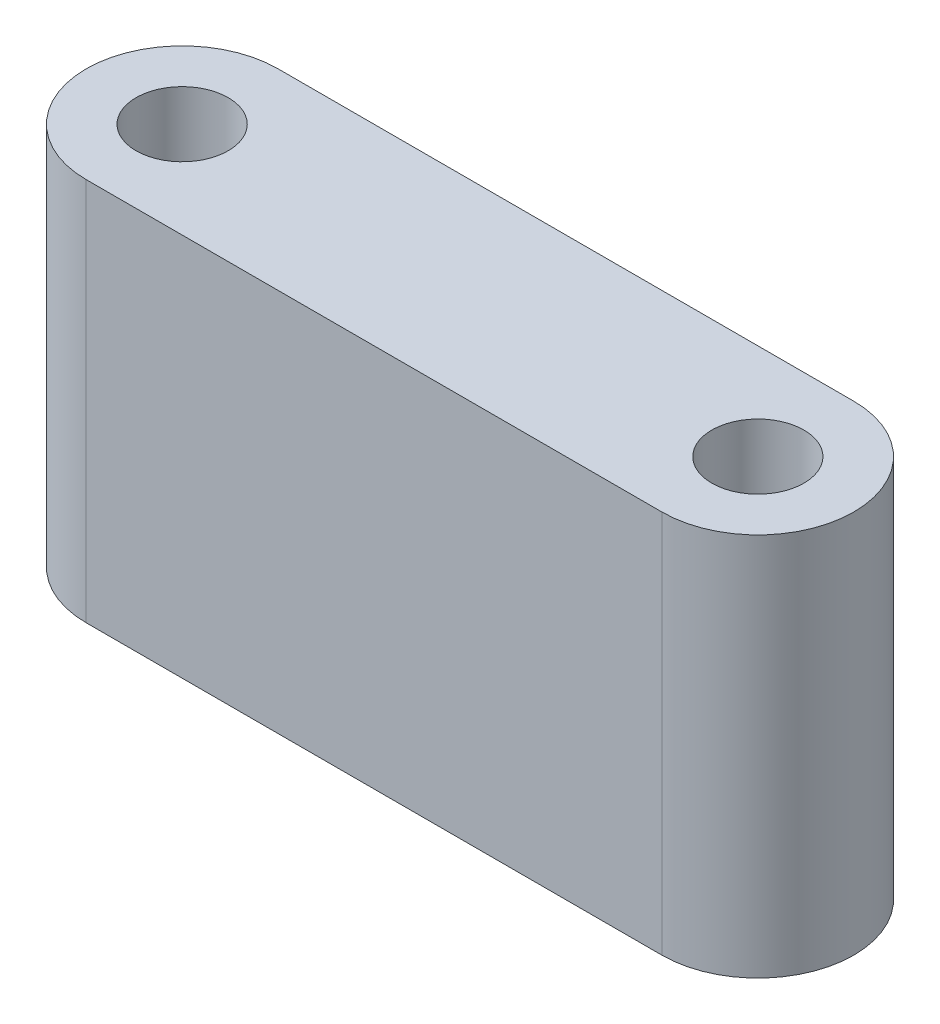
ISO-10303-21;
HEADER;
FILE_DESCRIPTION(('STEP AP214'),'2;1');
FILE_NAME('part.step','',(''),(''),'','','');
FILE_SCHEMA(('AUTOMOTIVE_DESIGN { 1 0 10303 214 1 1 1 1 }'));
ENDSEC;
DATA;
#1=APPLICATION_CONTEXT('core data for automotive mechanical design processes');
#2=APPLICATION_PROTOCOL_DEFINITION('international standard','automotive_design',2000,#1);
#3=PRODUCT_CONTEXT('',#1,'mechanical');
#4=PRODUCT('Part','Part','',(#3));
#5=PRODUCT_RELATED_PRODUCT_CATEGORY('part','',(#4));
#6=PRODUCT_DEFINITION_FORMATION('','',#4);
#7=PRODUCT_DEFINITION_CONTEXT('part definition',#1,'design');
#8=PRODUCT_DEFINITION('design','',#6,#7);
#9=PRODUCT_DEFINITION_SHAPE('','',#8);
#10=(LENGTH_UNIT() NAMED_UNIT(*) SI_UNIT(.MILLI.,.METRE.));
#11=(NAMED_UNIT(*) PLANE_ANGLE_UNIT() SI_UNIT($,.RADIAN.));
#12=(NAMED_UNIT(*) SI_UNIT($,.STERADIAN.) SOLID_ANGLE_UNIT());
#13=UNCERTAINTY_MEASURE_WITH_UNIT(LENGTH_MEASURE(1.E-05),#10,'distance_accuracy_value','');
#14=(GEOMETRIC_REPRESENTATION_CONTEXT(3) GLOBAL_UNCERTAINTY_ASSIGNED_CONTEXT((#13)) GLOBAL_UNIT_ASSIGNED_CONTEXT((#10,
#11,#12)) REPRESENTATION_CONTEXT('',''));
#15=CARTESIAN_POINT('',(0.,0.,0.));
#16=DIRECTION('',(0.,0.,1.));
#17=DIRECTION('',(1.,0.,0.));
#18=AXIS2_PLACEMENT_3D('',#15,#16,#17);
#19=CARTESIAN_POINT('',(0.,20.,0.));
#20=DIRECTION('',(0.,1.,0.));
#21=DIRECTION('',(0.,0.,1.));
#22=AXIS2_PLACEMENT_3D('',#19,#20,#21);
#23=PLANE('',#22);
#24=CARTESIAN_POINT('',(0.,20.,0.));
#25=DIRECTION('',(0.,1.,0.));
#26=DIRECTION('',(0.,0.,1.));
#27=AXIS2_PLACEMENT_3D('',#24,#25,#26);
#28=CIRCLE('',#27,2.4);
#29=CARTESIAN_POINT('',(0.,20.,2.4));
#30=VERTEX_POINT('',#29);
#31=EDGE_CURVE('E103',#30,#30,#28,.T.);
#32=ORIENTED_EDGE('',*,*,#31,.F.);
#33=EDGE_LOOP('',(#32));
#34=FACE_BOUND('',#33,.T.);
#35=CARTESIAN_POINT('',(0.,20.,0.));
#36=DIRECTION('',(0.,1.,0.));
#37=DIRECTION('',(0.,0.,1.));
#38=AXIS2_PLACEMENT_3D('',#35,#36,#37);
#39=CIRCLE('',#38,5.);
#40=CARTESIAN_POINT('',(0.,20.,-5.));
#41=VERTEX_POINT('',#40);
#42=CARTESIAN_POINT('',(0.,20.,5.));
#43=VERTEX_POINT('',#42);
#44=EDGE_CURVE('E88',#41,#43,#39,.T.);
#45=ORIENTED_EDGE('',*,*,#44,.T.);
#46=DIRECTION('',(1.,0.,0.));
#47=VECTOR('',#46,1.);
#48=CARTESIAN_POINT('',(0.,20.,5.));
#49=LINE('',#48,#47);
#50=CARTESIAN_POINT('',(30.,20.,5.));
#51=VERTEX_POINT('',#50);
#52=EDGE_CURVE('E83',#43,#51,#49,.T.);
#53=ORIENTED_EDGE('',*,*,#52,.T.);
#54=CARTESIAN_POINT('',(30.,20.,0.));
#55=DIRECTION('',(0.,1.,0.));
#56=DIRECTION('',(0.,0.,1.));
#57=AXIS2_PLACEMENT_3D('',#54,#55,#56);
#58=CIRCLE('',#57,5.);
#59=CARTESIAN_POINT('',(30.,20.,-5.));
#60=VERTEX_POINT('',#59);
#61=EDGE_CURVE('E86',#51,#60,#58,.T.);
#62=ORIENTED_EDGE('',*,*,#61,.T.);
#63=DIRECTION('',(-1.,0.,0.));
#64=VECTOR('',#63,1.);
#65=CARTESIAN_POINT('',(0.,20.,-5.));
#66=LINE('',#65,#64);
#67=EDGE_CURVE('E53',#60,#41,#66,.T.);
#68=ORIENTED_EDGE('',*,*,#67,.T.);
#69=EDGE_LOOP('',(#45,#53,#62,#68));
#70=FACE_BOUND('',#69,.T.);
#71=CARTESIAN_POINT('',(30.,20.,0.));
#72=DIRECTION('',(0.,1.,0.));
#73=DIRECTION('',(0.,0.,1.));
#74=AXIS2_PLACEMENT_3D('',#71,#72,#73);
#75=CIRCLE('',#74,2.4);
#76=CARTESIAN_POINT('',(30.,20.,2.4));
#77=VERTEX_POINT('',#76);
#78=EDGE_CURVE('E118',#77,#77,#75,.T.);
#79=ORIENTED_EDGE('',*,*,#78,.F.);
#80=EDGE_LOOP('',(#79));
#81=FACE_BOUND('',#80,.T.);
#82=ADVANCED_FACE('F36',(#34,#70,#81),#23,.T.);
#83=CARTESIAN_POINT('',(0.,0.,0.));
#84=DIRECTION('',(0.,1.,0.));
#85=DIRECTION('',(0.,0.,1.));
#86=AXIS2_PLACEMENT_3D('',#83,#84,#85);
#87=PLANE('',#86);
#88=CARTESIAN_POINT('',(0.,0.,0.));
#89=DIRECTION('',(0.,1.,0.));
#90=DIRECTION('',(0.,0.,1.));
#91=AXIS2_PLACEMENT_3D('',#88,#89,#90);
#92=CIRCLE('',#91,5.);
#93=CARTESIAN_POINT('',(0.,0.,-5.));
#94=VERTEX_POINT('',#93);
#95=CARTESIAN_POINT('',(0.,0.,5.));
#96=VERTEX_POINT('',#95);
#97=EDGE_CURVE('E100',#94,#96,#92,.T.);
#98=ORIENTED_EDGE('',*,*,#97,.F.);
#99=DIRECTION('',(-1.,0.,0.));
#100=VECTOR('',#99,1.);
#101=CARTESIAN_POINT('',(0.,0.,-5.));
#102=LINE('',#101,#100);
#103=CARTESIAN_POINT('',(30.,0.,-5.));
#104=VERTEX_POINT('',#103);
#105=EDGE_CURVE('E76',#104,#94,#102,.T.);
#106=ORIENTED_EDGE('',*,*,#105,.F.);
#107=CARTESIAN_POINT('',(30.,0.,0.));
#108=DIRECTION('',(0.,1.,0.));
#109=DIRECTION('',(0.,0.,1.));
#110=AXIS2_PLACEMENT_3D('',#107,#108,#109);
#111=CIRCLE('',#110,5.);
#112=CARTESIAN_POINT('',(30.,0.,5.));
#113=VERTEX_POINT('',#112);
#114=EDGE_CURVE('E70',#113,#104,#111,.T.);
#115=ORIENTED_EDGE('',*,*,#114,.F.);
#116=DIRECTION('',(1.,0.,0.));
#117=VECTOR('',#116,1.);
#118=CARTESIAN_POINT('',(0.,0.,5.));
#119=LINE('',#118,#117);
#120=EDGE_CURVE('E92',#96,#113,#119,.T.);
#121=ORIENTED_EDGE('',*,*,#120,.F.);
#122=EDGE_LOOP('',(#98,#106,#115,#121));
#123=FACE_BOUND('',#122,.T.);
#124=CARTESIAN_POINT('',(0.,0.,0.));
#125=DIRECTION('',(0.,1.,0.));
#126=DIRECTION('',(0.,0.,1.));
#127=AXIS2_PLACEMENT_3D('',#124,#125,#126);
#128=CIRCLE('',#127,2.4);
#129=CARTESIAN_POINT('',(0.,0.,2.4));
#130=VERTEX_POINT('',#129);
#131=EDGE_CURVE('E115',#130,#130,#128,.T.);
#132=ORIENTED_EDGE('',*,*,#131,.T.);
#133=EDGE_LOOP('',(#132));
#134=FACE_BOUND('',#133,.T.);
#135=CARTESIAN_POINT('',(30.,0.,0.));
#136=DIRECTION('',(0.,1.,0.));
#137=DIRECTION('',(0.,0.,1.));
#138=AXIS2_PLACEMENT_3D('',#135,#136,#137);
#139=CIRCLE('',#138,2.4);
#140=CARTESIAN_POINT('',(30.,0.,2.4));
#141=VERTEX_POINT('',#140);
#142=EDGE_CURVE('E121',#141,#141,#139,.T.);
#143=ORIENTED_EDGE('',*,*,#142,.T.);
#144=EDGE_LOOP('',(#143));
#145=FACE_BOUND('',#144,.T.);
#146=ADVANCED_FACE('F111',(#123,#134,#145),#87,.F.);
#147=CARTESIAN_POINT('',(0.,20.,0.));
#148=DIRECTION('',(0.,-1.,0.));
#149=DIRECTION('',(0.,0.,-1.));
#150=AXIS2_PLACEMENT_3D('',#147,#148,#149);
#151=CYLINDRICAL_SURFACE('',#150,5.);
#152=ORIENTED_EDGE('',*,*,#97,.T.);
#153=DIRECTION('',(0.,-1.,0.));
#154=VECTOR('',#153,1.);
#155=CARTESIAN_POINT('',(0.,20.,5.));
#156=LINE('',#155,#154);
#157=EDGE_CURVE('E11',#43,#96,#156,.T.);
#158=ORIENTED_EDGE('',*,*,#157,.F.);
#159=ORIENTED_EDGE('',*,*,#44,.F.);
#160=DIRECTION('',(0.,-1.,0.));
#161=VECTOR('',#160,1.);
#162=CARTESIAN_POINT('',(0.,20.,-5.));
#163=LINE('',#162,#161);
#164=EDGE_CURVE('E96',#41,#94,#163,.T.);
#165=ORIENTED_EDGE('',*,*,#164,.T.);
#166=EDGE_LOOP('',(#152,#158,#159,#165));
#167=FACE_BOUND('',#166,.T.);
#168=ADVANCED_FACE('F38',(#167),#151,.T.);
#169=CARTESIAN_POINT('',(0.,20.,5.));
#170=DIRECTION('',(0.,0.,-1.));
#171=DIRECTION('',(-1.,0.,0.));
#172=AXIS2_PLACEMENT_3D('',#169,#170,#171);
#173=PLANE('',#172);
#174=ORIENTED_EDGE('',*,*,#120,.T.);
#175=DIRECTION('',(0.,-1.,0.));
#176=VECTOR('',#175,1.);
#177=CARTESIAN_POINT('',(30.,20.,5.));
#178=LINE('',#177,#176);
#179=EDGE_CURVE('E45',#51,#113,#178,.T.);
#180=ORIENTED_EDGE('',*,*,#179,.F.);
#181=ORIENTED_EDGE('',*,*,#52,.F.);
#182=ORIENTED_EDGE('',*,*,#157,.T.);
#183=EDGE_LOOP('',(#174,#180,#181,#182));
#184=FACE_BOUND('',#183,.T.);
#185=ADVANCED_FACE('F91',(#184),#173,.F.);
#186=CARTESIAN_POINT('',(30.,20.,0.));
#187=DIRECTION('',(0.,-1.,0.));
#188=DIRECTION('',(0.,0.,-1.));
#189=AXIS2_PLACEMENT_3D('',#186,#187,#188);
#190=CYLINDRICAL_SURFACE('',#189,5.);
#191=ORIENTED_EDGE('',*,*,#114,.T.);
#192=DIRECTION('',(0.,-1.,0.));
#193=VECTOR('',#192,1.);
#194=CARTESIAN_POINT('',(30.,20.,-5.));
#195=LINE('',#194,#193);
#196=EDGE_CURVE('E93',#60,#104,#195,.T.);
#197=ORIENTED_EDGE('',*,*,#196,.F.);
#198=ORIENTED_EDGE('',*,*,#61,.F.);
#199=ORIENTED_EDGE('',*,*,#179,.T.);
#200=EDGE_LOOP('',(#191,#197,#198,#199));
#201=FACE_BOUND('',#200,.T.);
#202=ADVANCED_FACE('F94',(#201),#190,.T.);
#203=CARTESIAN_POINT('',(0.,20.,-5.));
#204=DIRECTION('',(0.,0.,1.));
#205=DIRECTION('',(1.,0.,0.));
#206=AXIS2_PLACEMENT_3D('',#203,#204,#205);
#207=PLANE('',#206);
#208=ORIENTED_EDGE('',*,*,#105,.T.);
#209=ORIENTED_EDGE('',*,*,#164,.F.);
#210=ORIENTED_EDGE('',*,*,#67,.F.);
#211=ORIENTED_EDGE('',*,*,#196,.T.);
#212=EDGE_LOOP('',(#208,#209,#210,#211));
#213=FACE_BOUND('',#212,.T.);
#214=ADVANCED_FACE('F108',(#213),#207,.F.);
#215=CARTESIAN_POINT('',(0.,20.,0.));
#216=DIRECTION('',(0.,-1.,0.));
#217=DIRECTION('',(0.,0.,-1.));
#218=AXIS2_PLACEMENT_3D('',#215,#216,#217);
#219=CYLINDRICAL_SURFACE('',#218,2.4);
#220=ORIENTED_EDGE('',*,*,#31,.T.);
#221=EDGE_LOOP('',(#220));
#222=FACE_BOUND('',#221,.T.);
#223=ORIENTED_EDGE('',*,*,#131,.F.);
#224=EDGE_LOOP('',(#223));
#225=FACE_BOUND('',#224,.T.);
#226=ADVANCED_FACE('F138',(#222,#225),#219,.F.);
#227=CARTESIAN_POINT('',(30.,20.,0.));
#228=DIRECTION('',(0.,-1.,0.));
#229=DIRECTION('',(0.,0.,-1.));
#230=AXIS2_PLACEMENT_3D('',#227,#228,#229);
#231=CYLINDRICAL_SURFACE('',#230,2.4);
#232=ORIENTED_EDGE('',*,*,#78,.T.);
#233=EDGE_LOOP('',(#232));
#234=FACE_BOUND('',#233,.T.);
#235=ORIENTED_EDGE('',*,*,#142,.F.);
#236=EDGE_LOOP('',(#235));
#237=FACE_BOUND('',#236,.T.);
#238=ADVANCED_FACE('F127',(#234,#237),#231,.F.);
#239=CLOSED_SHELL('',(#82,#146,#168,#185,#202,#214,#226,#238));
#240=MANIFOLD_SOLID_BREP('B2',#239);
#241=ADVANCED_BREP_SHAPE_REPRESENTATION('',(#18,#240),#14);
#242=SHAPE_DEFINITION_REPRESENTATION(#9,#241);
ENDSEC;
END-ISO-10303-21;
